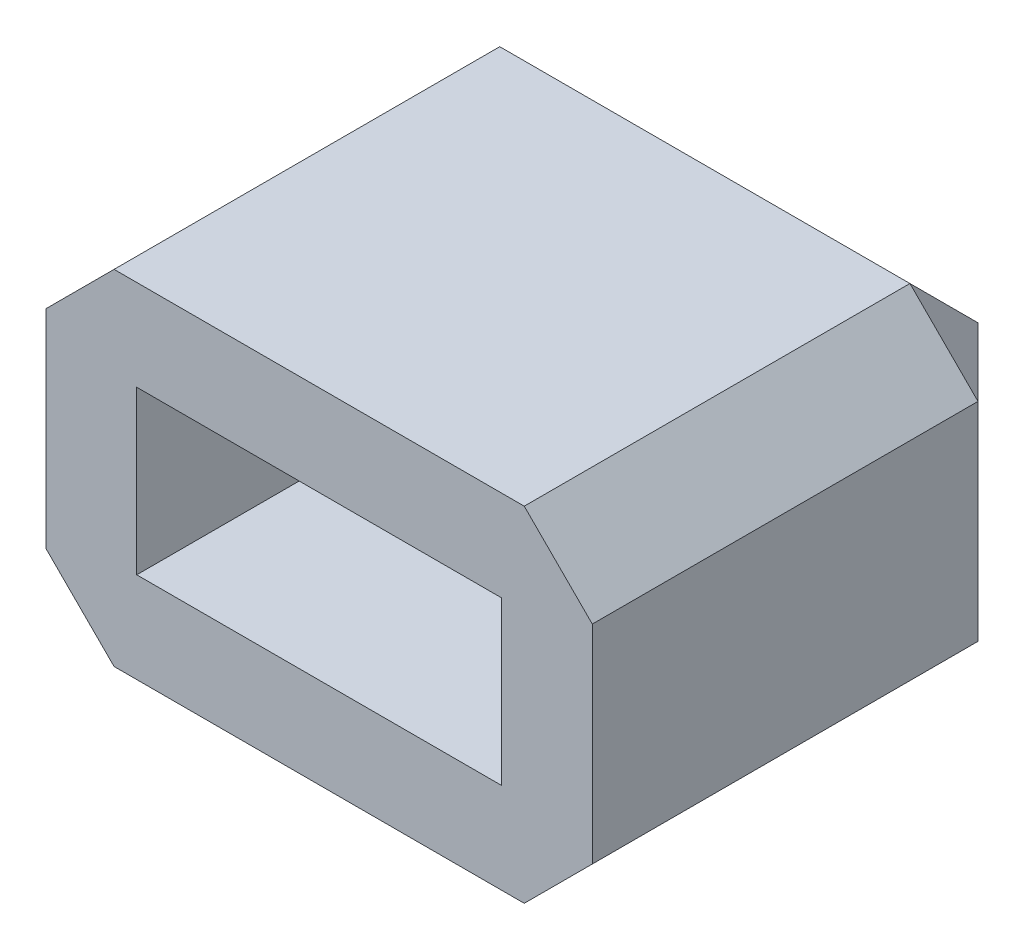
ISO-10303-21;
HEADER;
FILE_DESCRIPTION(('STEP AP214'),'2;1');
FILE_NAME('part.step','',(''),(''),'','','');
FILE_SCHEMA(('AUTOMOTIVE_DESIGN { 1 0 10303 214 1 1 1 1 }'));
ENDSEC;
DATA;
#1=APPLICATION_CONTEXT('core data for automotive mechanical design processes');
#2=APPLICATION_PROTOCOL_DEFINITION('international standard','automotive_design',2000,#1);
#3=PRODUCT_CONTEXT('',#1,'mechanical');
#4=PRODUCT('Part','Part','',(#3));
#5=PRODUCT_RELATED_PRODUCT_CATEGORY('part','',(#4));
#6=PRODUCT_DEFINITION_FORMATION('','',#4);
#7=PRODUCT_DEFINITION_CONTEXT('part definition',#1,'design');
#8=PRODUCT_DEFINITION('design','',#6,#7);
#9=PRODUCT_DEFINITION_SHAPE('','',#8);
#10=(LENGTH_UNIT() NAMED_UNIT(*) SI_UNIT(.MILLI.,.METRE.));
#11=(NAMED_UNIT(*) PLANE_ANGLE_UNIT() SI_UNIT($,.RADIAN.));
#12=(NAMED_UNIT(*) SI_UNIT($,.STERADIAN.) SOLID_ANGLE_UNIT());
#13=UNCERTAINTY_MEASURE_WITH_UNIT(LENGTH_MEASURE(1.E-05),#10,'distance_accuracy_value','');
#14=(GEOMETRIC_REPRESENTATION_CONTEXT(3) GLOBAL_UNCERTAINTY_ASSIGNED_CONTEXT((#13)) GLOBAL_UNIT_ASSIGNED_CONTEXT((#10,
#11,#12)) REPRESENTATION_CONTEXT('',''));
#15=CARTESIAN_POINT('',(0.,0.,0.));
#16=DIRECTION('',(0.,0.,1.));
#17=DIRECTION('',(1.,0.,0.));
#18=AXIS2_PLACEMENT_3D('',#15,#16,#17);
#19=CARTESIAN_POINT('',(0.,0.,8.));
#20=DIRECTION('',(0.,0.,1.));
#21=DIRECTION('',(1.,0.,0.));
#22=AXIS2_PLACEMENT_3D('',#19,#20,#21);
#23=PLANE('',#22);
#24=DIRECTION('',(0.,-1.,0.));
#25=VECTOR('',#24,1.);
#26=CARTESIAN_POINT('',(-6.02,3.79,8.));
#27=LINE('',#26,#25);
#28=CARTESIAN_POINT('',(-6.02,2.29,8.));
#29=VERTEX_POINT('',#28);
#30=CARTESIAN_POINT('',(-6.02,-2.29,8.));
#31=VERTEX_POINT('',#30);
#32=EDGE_CURVE('E200',#29,#31,#27,.T.);
#33=ORIENTED_EDGE('',*,*,#32,.T.);
#34=DIRECTION('',(-0.707106781186547,0.707106781186548,0.));
#35=VECTOR('',#34,1.);
#36=CARTESIAN_POINT('',(-4.15500000000001,-4.155,8.));
#37=LINE('',#36,#35);
#38=CARTESIAN_POINT('',(-4.52,-3.79,8.));
#39=VERTEX_POINT('',#38);
#40=EDGE_CURVE('E236',#31,#39,#37,.F.);
#41=ORIENTED_EDGE('',*,*,#40,.T.);
#42=DIRECTION('',(1.,0.,0.));
#43=VECTOR('',#42,1.);
#44=CARTESIAN_POINT('',(-6.02,-3.79,8.));
#45=LINE('',#44,#43);
#46=CARTESIAN_POINT('',(4.52,-3.79,8.));
#47=VERTEX_POINT('',#46);
#48=EDGE_CURVE('E204',#39,#47,#45,.T.);
#49=ORIENTED_EDGE('',*,*,#48,.T.);
#50=DIRECTION('',(-0.707106781186547,-0.707106781186548,0.));
#51=VECTOR('',#50,1.);
#52=CARTESIAN_POINT('',(4.15500000000001,-4.155,8.));
#53=LINE('',#52,#51);
#54=CARTESIAN_POINT('',(6.02,-2.29,8.));
#55=VERTEX_POINT('',#54);
#56=EDGE_CURVE('E227',#47,#55,#53,.F.);
#57=ORIENTED_EDGE('',*,*,#56,.T.);
#58=DIRECTION('',(0.,1.,0.));
#59=VECTOR('',#58,1.);
#60=CARTESIAN_POINT('',(6.02,3.79,8.));
#61=LINE('',#60,#59);
#62=CARTESIAN_POINT('',(6.02,2.29,8.));
#63=VERTEX_POINT('',#62);
#64=EDGE_CURVE('E192',#55,#63,#61,.T.);
#65=ORIENTED_EDGE('',*,*,#64,.T.);
#66=DIRECTION('',(0.707106781186547,-0.707106781186548,0.));
#67=VECTOR('',#66,1.);
#68=CARTESIAN_POINT('',(4.15500000000001,4.155,8.));
#69=LINE('',#68,#67);
#70=CARTESIAN_POINT('',(4.52,3.79,8.));
#71=VERTEX_POINT('',#70);
#72=EDGE_CURVE('E230',#63,#71,#69,.F.);
#73=ORIENTED_EDGE('',*,*,#72,.T.);
#74=DIRECTION('',(-1.,0.,0.));
#75=VECTOR('',#74,1.);
#76=CARTESIAN_POINT('',(-6.02,3.79,8.));
#77=LINE('',#76,#75);
#78=CARTESIAN_POINT('',(-4.52,3.79,8.));
#79=VERTEX_POINT('',#78);
#80=EDGE_CURVE('E196',#71,#79,#77,.T.);
#81=ORIENTED_EDGE('',*,*,#80,.T.);
#82=DIRECTION('',(0.707106781186548,0.707106781186547,0.));
#83=VECTOR('',#82,1.);
#84=CARTESIAN_POINT('',(-4.15499999999999,4.155,8.));
#85=LINE('',#84,#83);
#86=EDGE_CURVE('E233',#79,#29,#85,.F.);
#87=ORIENTED_EDGE('',*,*,#86,.T.);
#88=EDGE_LOOP('',(#33,#41,#49,#57,#65,#73,#81,#87));
#89=FACE_BOUND('',#88,.T.);
#90=DIRECTION('',(1.,0.,0.));
#91=VECTOR('',#90,1.);
#92=CARTESIAN_POINT('',(4.02,-1.79,8.));
#93=LINE('',#92,#91);
#94=CARTESIAN_POINT('',(-4.02,-1.79,8.));
#95=VERTEX_POINT('',#94);
#96=CARTESIAN_POINT('',(4.02,-1.79,8.));
#97=VERTEX_POINT('',#96);
#98=EDGE_CURVE('E180',#95,#97,#93,.T.);
#99=ORIENTED_EDGE('',*,*,#98,.F.);
#100=DIRECTION('',(0.,-1.,0.));
#101=VECTOR('',#100,1.);
#102=CARTESIAN_POINT('',(-4.02,-1.79,8.));
#103=LINE('',#102,#101);
#104=CARTESIAN_POINT('',(-4.02,1.79,8.));
#105=VERTEX_POINT('',#104);
#106=EDGE_CURVE('E175',#105,#95,#103,.T.);
#107=ORIENTED_EDGE('',*,*,#106,.F.);
#108=DIRECTION('',(-1.,0.,0.));
#109=VECTOR('',#108,1.);
#110=CARTESIAN_POINT('',(4.02,1.79,8.));
#111=LINE('',#110,#109);
#112=CARTESIAN_POINT('',(4.02,1.79,8.));
#113=VERTEX_POINT('',#112);
#114=EDGE_CURVE('E154',#113,#105,#111,.T.);
#115=ORIENTED_EDGE('',*,*,#114,.F.);
#116=DIRECTION('',(0.,1.,0.));
#117=VECTOR('',#116,1.);
#118=CARTESIAN_POINT('',(4.02,-1.79,8.));
#119=LINE('',#118,#117);
#120=EDGE_CURVE('E616',#97,#113,#119,.T.);
#121=ORIENTED_EDGE('',*,*,#120,.F.);
#122=EDGE_LOOP('',(#99,#107,#115,#121));
#123=FACE_BOUND('',#122,.T.);
#124=ADVANCED_FACE('F45',(#89,#123),#23,.T.);
#125=CARTESIAN_POINT('',(6.02,3.79,8.));
#126=DIRECTION('',(-1.,0.,0.));
#127=DIRECTION('',(0.,0.,1.));
#128=AXIS2_PLACEMENT_3D('',#125,#126,#127);
#129=PLANE('',#128);
#130=DIRECTION('',(0.,1.,0.));
#131=VECTOR('',#130,1.);
#132=CARTESIAN_POINT('',(6.02,3.79,-0.499999999999999));
#133=LINE('',#132,#131);
#134=CARTESIAN_POINT('',(6.02,-2.29,-0.499999999999999));
#135=VERTEX_POINT('',#134);
#136=CARTESIAN_POINT('',(6.02,2.29,-0.499999999999999));
#137=VERTEX_POINT('',#136);
#138=EDGE_CURVE('E63',#135,#137,#133,.T.);
#139=ORIENTED_EDGE('',*,*,#138,.T.);
#140=DIRECTION('',(0.,0.,1.));
#141=VECTOR('',#140,1.);
#142=CARTESIAN_POINT('',(6.02,2.29,8.));
#143=LINE('',#142,#141);
#144=EDGE_CURVE('E11',#137,#63,#143,.T.);
#145=ORIENTED_EDGE('',*,*,#144,.T.);
#146=ORIENTED_EDGE('',*,*,#64,.F.);
#147=DIRECTION('',(0.,0.,-1.));
#148=VECTOR('',#147,1.);
#149=CARTESIAN_POINT('',(6.02,-2.29,8.));
#150=LINE('',#149,#148);
#151=EDGE_CURVE('E56',#55,#135,#150,.T.);
#152=ORIENTED_EDGE('',*,*,#151,.T.);
#153=EDGE_LOOP('',(#139,#145,#146,#152));
#154=FACE_BOUND('',#153,.T.);
#155=ADVANCED_FACE('F320',(#154),#129,.F.);
#156=CARTESIAN_POINT('',(-6.02,3.79,8.));
#157=DIRECTION('',(0.,-1.,0.));
#158=DIRECTION('',(0.,0.,-1.));
#159=AXIS2_PLACEMENT_3D('',#156,#157,#158);
#160=PLANE('',#159);
#161=DIRECTION('',(-1.,0.,0.));
#162=VECTOR('',#161,1.);
#163=CARTESIAN_POINT('',(-6.02,3.79,-0.499999999999999));
#164=LINE('',#163,#162);
#165=CARTESIAN_POINT('',(4.52,3.79,-0.499999999999999));
#166=VERTEX_POINT('',#165);
#167=CARTESIAN_POINT('',(-4.52,3.79,-0.499999999999999));
#168=VERTEX_POINT('',#167);
#169=EDGE_CURVE('E255',#166,#168,#164,.T.);
#170=ORIENTED_EDGE('',*,*,#169,.T.);
#171=DIRECTION('',(0.,0.,1.));
#172=VECTOR('',#171,1.);
#173=CARTESIAN_POINT('',(-4.52,3.79,8.));
#174=LINE('',#173,#172);
#175=EDGE_CURVE('E258',#168,#79,#174,.T.);
#176=ORIENTED_EDGE('',*,*,#175,.T.);
#177=ORIENTED_EDGE('',*,*,#80,.F.);
#178=DIRECTION('',(0.,0.,-1.));
#179=VECTOR('',#178,1.);
#180=CARTESIAN_POINT('',(4.52,3.79,8.));
#181=LINE('',#180,#179);
#182=EDGE_CURVE('E252',#71,#166,#181,.T.);
#183=ORIENTED_EDGE('',*,*,#182,.T.);
#184=EDGE_LOOP('',(#170,#176,#177,#183));
#185=FACE_BOUND('',#184,.T.);
#186=ADVANCED_FACE('F345',(#185),#160,.F.);
#187=CARTESIAN_POINT('',(-6.02,3.79,8.));
#188=DIRECTION('',(1.,0.,0.));
#189=DIRECTION('',(0.,0.,-1.));
#190=AXIS2_PLACEMENT_3D('',#187,#188,#189);
#191=PLANE('',#190);
#192=DIRECTION('',(0.,-1.,0.));
#193=VECTOR('',#192,1.);
#194=CARTESIAN_POINT('',(-6.02,3.79,-0.499999999999999));
#195=LINE('',#194,#193);
#196=CARTESIAN_POINT('',(-6.02,2.29,-0.499999999999999));
#197=VERTEX_POINT('',#196);
#198=CARTESIAN_POINT('',(-6.02,-2.29,-0.499999999999999));
#199=VERTEX_POINT('',#198);
#200=EDGE_CURVE('E221',#197,#199,#195,.T.);
#201=ORIENTED_EDGE('',*,*,#200,.T.);
#202=DIRECTION('',(0.,0.,1.));
#203=VECTOR('',#202,1.);
#204=CARTESIAN_POINT('',(-6.02,-2.29,8.));
#205=LINE('',#204,#203);
#206=EDGE_CURVE('E224',#199,#31,#205,.T.);
#207=ORIENTED_EDGE('',*,*,#206,.T.);
#208=ORIENTED_EDGE('',*,*,#32,.F.);
#209=DIRECTION('',(0.,0.,-1.));
#210=VECTOR('',#209,1.);
#211=CARTESIAN_POINT('',(-6.02,2.29,8.));
#212=LINE('',#211,#210);
#213=EDGE_CURVE('E218',#29,#197,#212,.T.);
#214=ORIENTED_EDGE('',*,*,#213,.T.);
#215=EDGE_LOOP('',(#201,#207,#208,#214));
#216=FACE_BOUND('',#215,.T.);
#217=ADVANCED_FACE('F355',(#216),#191,.F.);
#218=CARTESIAN_POINT('',(-6.02,-3.79,8.));
#219=DIRECTION('',(0.,1.,0.));
#220=DIRECTION('',(0.,0.,1.));
#221=AXIS2_PLACEMENT_3D('',#218,#219,#220);
#222=PLANE('',#221);
#223=ORIENTED_EDGE('',*,*,#48,.F.);
#224=DIRECTION('',(0.,0.,-1.));
#225=VECTOR('',#224,1.);
#226=CARTESIAN_POINT('',(-4.52,-3.79,8.));
#227=LINE('',#226,#225);
#228=CARTESIAN_POINT('',(-4.52,-3.79,-0.499999999999999));
#229=VERTEX_POINT('',#228);
#230=EDGE_CURVE('E214',#39,#229,#227,.T.);
#231=ORIENTED_EDGE('',*,*,#230,.T.);
#232=DIRECTION('',(1.,0.,0.));
#233=VECTOR('',#232,1.);
#234=CARTESIAN_POINT('',(-6.02,-3.79,-0.499999999999999));
#235=LINE('',#234,#233);
#236=CARTESIAN_POINT('',(4.52,-3.79,-0.499999999999999));
#237=VERTEX_POINT('',#236);
#238=EDGE_CURVE('E211',#229,#237,#235,.T.);
#239=ORIENTED_EDGE('',*,*,#238,.T.);
#240=DIRECTION('',(0.,0.,1.));
#241=VECTOR('',#240,1.);
#242=CARTESIAN_POINT('',(4.52,-3.79,8.));
#243=LINE('',#242,#241);
#244=EDGE_CURVE('E208',#237,#47,#243,.T.);
#245=ORIENTED_EDGE('',*,*,#244,.T.);
#246=EDGE_LOOP('',(#223,#231,#239,#245));
#247=FACE_BOUND('',#246,.T.);
#248=ADVANCED_FACE('F370',(#247),#222,.F.);
#249=CARTESIAN_POINT('',(-4.02,-1.79,8.));
#250=DIRECTION('',(1.,0.,0.));
#251=DIRECTION('',(0.,0.,-1.));
#252=AXIS2_PLACEMENT_3D('',#249,#250,#251);
#253=PLANE('',#252);
#254=DIRECTION('',(0.,-1.,0.));
#255=VECTOR('',#254,1.);
#256=CARTESIAN_POINT('',(-4.02,-1.79,0.));
#257=LINE('',#256,#255);
#258=CARTESIAN_POINT('',(-4.02,1.79,0.));
#259=VERTEX_POINT('',#258);
#260=CARTESIAN_POINT('',(-4.02,-1.79,0.));
#261=VERTEX_POINT('',#260);
#262=EDGE_CURVE('E162',#259,#261,#257,.T.);
#263=ORIENTED_EDGE('',*,*,#262,.F.);
#264=DIRECTION('',(0.,0.,-1.));
#265=VECTOR('',#264,1.);
#266=CARTESIAN_POINT('',(-4.02,1.79,8.));
#267=LINE('',#266,#265);
#268=EDGE_CURVE('E147',#105,#259,#267,.T.);
#269=ORIENTED_EDGE('',*,*,#268,.F.);
#270=ORIENTED_EDGE('',*,*,#106,.T.);
#271=DIRECTION('',(0.,0.,-1.));
#272=VECTOR('',#271,1.);
#273=CARTESIAN_POINT('',(-4.02,-1.79,8.));
#274=LINE('',#273,#272);
#275=EDGE_CURVE('E165',#95,#261,#274,.T.);
#276=ORIENTED_EDGE('',*,*,#275,.T.);
#277=EDGE_LOOP('',(#263,#269,#270,#276));
#278=FACE_BOUND('',#277,.T.);
#279=ADVANCED_FACE('F163',(#278),#253,.T.);
#280=CARTESIAN_POINT('',(4.02,-1.79,8.));
#281=DIRECTION('',(0.,1.,0.));
#282=DIRECTION('',(0.,0.,1.));
#283=AXIS2_PLACEMENT_3D('',#280,#281,#282);
#284=PLANE('',#283);
#285=DIRECTION('',(1.,0.,0.));
#286=VECTOR('',#285,1.);
#287=CARTESIAN_POINT('',(4.02,-1.79,0.));
#288=LINE('',#287,#286);
#289=CARTESIAN_POINT('',(4.02,-1.79,0.));
#290=VERTEX_POINT('',#289);
#291=EDGE_CURVE('E169',#261,#290,#288,.T.);
#292=ORIENTED_EDGE('',*,*,#291,.F.);
#293=ORIENTED_EDGE('',*,*,#275,.F.);
#294=ORIENTED_EDGE('',*,*,#98,.T.);
#295=DIRECTION('',(0.,0.,-1.));
#296=VECTOR('',#295,1.);
#297=CARTESIAN_POINT('',(4.02,-1.79,8.));
#298=LINE('',#297,#296);
#299=EDGE_CURVE('E187',#97,#290,#298,.T.);
#300=ORIENTED_EDGE('',*,*,#299,.T.);
#301=EDGE_LOOP('',(#292,#293,#294,#300));
#302=FACE_BOUND('',#301,.T.);
#303=ADVANCED_FACE('F378',(#302),#284,.T.);
#304=CARTESIAN_POINT('',(4.02,-1.79,8.));
#305=DIRECTION('',(-1.,0.,0.));
#306=DIRECTION('',(0.,0.,1.));
#307=AXIS2_PLACEMENT_3D('',#304,#305,#306);
#308=PLANE('',#307);
#309=DIRECTION('',(0.,1.,0.));
#310=VECTOR('',#309,1.);
#311=CARTESIAN_POINT('',(4.02,-1.79,0.));
#312=LINE('',#311,#310);
#313=CARTESIAN_POINT('',(4.02,1.79,0.));
#314=VERTEX_POINT('',#313);
#315=EDGE_CURVE('E173',#290,#314,#312,.T.);
#316=ORIENTED_EDGE('',*,*,#315,.F.);
#317=ORIENTED_EDGE('',*,*,#299,.F.);
#318=ORIENTED_EDGE('',*,*,#120,.T.);
#319=DIRECTION('',(0.,0.,-1.));
#320=VECTOR('',#319,1.);
#321=CARTESIAN_POINT('',(4.02,1.79,8.));
#322=LINE('',#321,#320);
#323=EDGE_CURVE('E158',#113,#314,#322,.T.);
#324=ORIENTED_EDGE('',*,*,#323,.T.);
#325=EDGE_LOOP('',(#316,#317,#318,#324));
#326=FACE_BOUND('',#325,.T.);
#327=ADVANCED_FACE('F391',(#326),#308,.T.);
#328=CARTESIAN_POINT('',(4.02,1.79,8.));
#329=DIRECTION('',(0.,-1.,0.));
#330=DIRECTION('',(0.,0.,-1.));
#331=AXIS2_PLACEMENT_3D('',#328,#329,#330);
#332=PLANE('',#331);
#333=DIRECTION('',(-1.,0.,0.));
#334=VECTOR('',#333,1.);
#335=CARTESIAN_POINT('',(4.02,1.79,0.));
#336=LINE('',#335,#334);
#337=EDGE_CURVE('E151',#314,#259,#336,.T.);
#338=ORIENTED_EDGE('',*,*,#337,.F.);
#339=ORIENTED_EDGE('',*,*,#323,.F.);
#340=ORIENTED_EDGE('',*,*,#114,.T.);
#341=ORIENTED_EDGE('',*,*,#268,.T.);
#342=EDGE_LOOP('',(#338,#339,#340,#341));
#343=FACE_BOUND('',#342,.T.);
#344=ADVANCED_FACE('F149',(#343),#332,.T.);
#345=CARTESIAN_POINT('',(0.,0.,0.));
#346=DIRECTION('',(0.,0.,1.));
#347=DIRECTION('',(1.,0.,0.));
#348=AXIS2_PLACEMENT_3D('',#345,#346,#347);
#349=PLANE('',#348);
#350=ORIENTED_EDGE('',*,*,#337,.T.);
#351=ORIENTED_EDGE('',*,*,#262,.T.);
#352=ORIENTED_EDGE('',*,*,#291,.T.);
#353=ORIENTED_EDGE('',*,*,#315,.T.);
#354=EDGE_LOOP('',(#350,#351,#352,#353));
#355=FACE_BOUND('',#354,.T.);
#356=ADVANCED_FACE('F171',(#355),#349,.T.);
#357=CARTESIAN_POINT('',(0.,0.,-2.));
#358=DIRECTION('',(0.,0.,1.));
#359=DIRECTION('',(1.,0.,0.));
#360=AXIS2_PLACEMENT_3D('',#357,#358,#359);
#361=PLANE('',#360);
#362=DIRECTION('',(0.,-1.,0.));
#363=VECTOR('',#362,1.);
#364=CARTESIAN_POINT('',(4.52,0.,-2.));
#365=LINE('',#364,#363);
#366=CARTESIAN_POINT('',(4.52,2.29,-2.));
#367=VERTEX_POINT('',#366);
#368=CARTESIAN_POINT('',(4.52,-2.29,-2.));
#369=VERTEX_POINT('',#368);
#370=EDGE_CURVE('E239',#367,#369,#365,.T.);
#371=ORIENTED_EDGE('',*,*,#370,.T.);
#372=DIRECTION('',(-1.,0.,0.));
#373=VECTOR('',#372,1.);
#374=CARTESIAN_POINT('',(0.,-2.29,-2.));
#375=LINE('',#374,#373);
#376=CARTESIAN_POINT('',(-4.52,-2.29,-2.));
#377=VERTEX_POINT('',#376);
#378=EDGE_CURVE('E248',#369,#377,#375,.T.);
#379=ORIENTED_EDGE('',*,*,#378,.T.);
#380=DIRECTION('',(0.,1.,0.));
#381=VECTOR('',#380,1.);
#382=CARTESIAN_POINT('',(-4.52,0.,-2.));
#383=LINE('',#382,#381);
#384=CARTESIAN_POINT('',(-4.52,2.29,-2.));
#385=VERTEX_POINT('',#384);
#386=EDGE_CURVE('E245',#377,#385,#383,.T.);
#387=ORIENTED_EDGE('',*,*,#386,.T.);
#388=DIRECTION('',(1.,0.,0.));
#389=VECTOR('',#388,1.);
#390=CARTESIAN_POINT('',(0.,2.29,-2.));
#391=LINE('',#390,#389);
#392=EDGE_CURVE('E242',#385,#367,#391,.T.);
#393=ORIENTED_EDGE('',*,*,#392,.T.);
#394=EDGE_LOOP('',(#371,#379,#387,#393));
#395=FACE_BOUND('',#394,.T.);
#396=ADVANCED_FACE('F337',(#395),#361,.F.);
#397=CARTESIAN_POINT('',(4.52,3.79,8.));
#398=DIRECTION('',(-0.707106781186548,-0.707106781186547,0.));
#399=DIRECTION('',(0.,0.,-1.));
#400=AXIS2_PLACEMENT_3D('',#397,#398,#399);
#401=PLANE('',#400);
#402=DIRECTION('',(-0.707106781186547,0.707106781186548,0.));
#403=VECTOR('',#402,1.);
#404=CARTESIAN_POINT('',(5.27,3.04,-0.499999999999999));
#405=LINE('',#404,#403);
#406=EDGE_CURVE('E50',#166,#137,#405,.F.);
#407=ORIENTED_EDGE('',*,*,#406,.F.);
#408=ORIENTED_EDGE('',*,*,#182,.F.);
#409=ORIENTED_EDGE('',*,*,#72,.F.);
#410=ORIENTED_EDGE('',*,*,#144,.F.);
#411=EDGE_LOOP('',(#407,#408,#409,#410));
#412=FACE_BOUND('',#411,.T.);
#413=ADVANCED_FACE('F48',(#412),#401,.F.);
#414=CARTESIAN_POINT('',(4.52,2.29,-2.));
#415=DIRECTION('',(0.577350269189627,0.577350269189626,-0.577350269189624));
#416=DIRECTION('',(-0.707106781186547,0.707106781186548,0.));
#417=AXIS2_PLACEMENT_3D('',#414,#415,#416);
#418=PLANE('',#417);
#419=DIRECTION('',(0.,-0.707106781186547,-0.707106781186548));
#420=VECTOR('',#419,1.);
#421=CARTESIAN_POINT('',(4.52,2.29,-2.));
#422=LINE('',#421,#420);
#423=EDGE_CURVE('E299',#166,#367,#422,.T.);
#424=ORIENTED_EDGE('',*,*,#423,.F.);
#425=ORIENTED_EDGE('',*,*,#406,.T.);
#426=DIRECTION('',(0.707106781186547,0.,0.707106781186548));
#427=VECTOR('',#426,1.);
#428=CARTESIAN_POINT('',(4.52,2.29,-2.));
#429=LINE('',#428,#427);
#430=EDGE_CURVE('E302',#367,#137,#429,.T.);
#431=ORIENTED_EDGE('',*,*,#430,.F.);
#432=EDGE_LOOP('',(#424,#425,#431));
#433=FACE_BOUND('',#432,.T.);
#434=ADVANCED_FACE('F315',(#433),#418,.T.);
#435=CARTESIAN_POINT('',(6.02,-2.29,8.));
#436=DIRECTION('',(-0.707106781186548,0.707106781186547,0.));
#437=DIRECTION('',(0.,0.,-1.));
#438=AXIS2_PLACEMENT_3D('',#435,#436,#437);
#439=PLANE('',#438);
#440=ORIENTED_EDGE('',*,*,#56,.F.);
#441=ORIENTED_EDGE('',*,*,#244,.F.);
#442=DIRECTION('',(0.707106781186547,0.707106781186548,0.));
#443=VECTOR('',#442,1.);
#444=CARTESIAN_POINT('',(4.52,-3.79,-0.499999999999999));
#445=LINE('',#444,#443);
#446=EDGE_CURVE('E295',#135,#237,#445,.F.);
#447=ORIENTED_EDGE('',*,*,#446,.F.);
#448=ORIENTED_EDGE('',*,*,#151,.F.);
#449=EDGE_LOOP('',(#440,#441,#447,#448));
#450=FACE_BOUND('',#449,.T.);
#451=ADVANCED_FACE('F328',(#450),#439,.F.);
#452=CARTESIAN_POINT('',(4.52,0.,-2.));
#453=DIRECTION('',(-0.707106781186548,0.,0.707106781186547));
#454=DIRECTION('',(0.,-1.,0.));
#455=AXIS2_PLACEMENT_3D('',#452,#453,#454);
#456=PLANE('',#455);
#457=ORIENTED_EDGE('',*,*,#430,.T.);
#458=ORIENTED_EDGE('',*,*,#138,.F.);
#459=DIRECTION('',(-0.707106781186547,0.,-0.707106781186548));
#460=VECTOR('',#459,1.);
#461=CARTESIAN_POINT('',(5.27,-2.29,-1.25));
#462=LINE('',#461,#460);
#463=EDGE_CURVE('E291',#369,#135,#462,.F.);
#464=ORIENTED_EDGE('',*,*,#463,.F.);
#465=ORIENTED_EDGE('',*,*,#370,.F.);
#466=EDGE_LOOP('',(#457,#458,#464,#465));
#467=FACE_BOUND('',#466,.T.);
#468=ADVANCED_FACE('F335',(#467),#456,.F.);
#469=CARTESIAN_POINT('',(0.,2.29,-2.));
#470=DIRECTION('',(0.,-0.707106781186548,0.707106781186547));
#471=DIRECTION('',(1.,0.,0.));
#472=AXIS2_PLACEMENT_3D('',#469,#470,#471);
#473=PLANE('',#472);
#474=ORIENTED_EDGE('',*,*,#423,.T.);
#475=ORIENTED_EDGE('',*,*,#392,.F.);
#476=DIRECTION('',(0.,0.707106781186547,0.707106781186548));
#477=VECTOR('',#476,1.);
#478=CARTESIAN_POINT('',(-4.52,2.29,-2.));
#479=LINE('',#478,#477);
#480=EDGE_CURVE('E287',#168,#385,#479,.F.);
#481=ORIENTED_EDGE('',*,*,#480,.F.);
#482=ORIENTED_EDGE('',*,*,#169,.F.);
#483=EDGE_LOOP('',(#474,#475,#481,#482));
#484=FACE_BOUND('',#483,.T.);
#485=ADVANCED_FACE('F342',(#484),#473,.F.);
#486=CARTESIAN_POINT('',(-6.02,2.29,8.));
#487=DIRECTION('',(0.707106781186547,-0.707106781186548,0.));
#488=DIRECTION('',(0.,0.,-1.));
#489=AXIS2_PLACEMENT_3D('',#486,#487,#488);
#490=PLANE('',#489);
#491=ORIENTED_EDGE('',*,*,#86,.F.);
#492=ORIENTED_EDGE('',*,*,#175,.F.);
#493=DIRECTION('',(-0.707106781186548,-0.707106781186547,0.));
#494=VECTOR('',#493,1.);
#495=CARTESIAN_POINT('',(-5.27,3.04,-0.499999999999999));
#496=LINE('',#495,#494);
#497=EDGE_CURVE('E283',#197,#168,#496,.F.);
#498=ORIENTED_EDGE('',*,*,#497,.F.);
#499=ORIENTED_EDGE('',*,*,#213,.F.);
#500=EDGE_LOOP('',(#491,#492,#498,#499));
#501=FACE_BOUND('',#500,.T.);
#502=ADVANCED_FACE('F349',(#501),#490,.F.);
#503=CARTESIAN_POINT('',(4.52,-3.79,-0.499999999999999));
#504=DIRECTION('',(0.577350269189627,-0.577350269189626,-0.577350269189624));
#505=DIRECTION('',(0.707106781186547,0.707106781186548,0.));
#506=AXIS2_PLACEMENT_3D('',#503,#504,#505);
#507=PLANE('',#506);
#508=ORIENTED_EDGE('',*,*,#463,.T.);
#509=ORIENTED_EDGE('',*,*,#446,.T.);
#510=DIRECTION('',(0.,-0.707106781186547,0.707106781186548));
#511=VECTOR('',#510,1.);
#512=CARTESIAN_POINT('',(4.52,-3.79,-0.499999999999999));
#513=LINE('',#512,#511);
#514=EDGE_CURVE('E279',#369,#237,#513,.T.);
#515=ORIENTED_EDGE('',*,*,#514,.F.);
#516=EDGE_LOOP('',(#508,#509,#515));
#517=FACE_BOUND('',#516,.T.);
#518=ADVANCED_FACE('F333',(#517),#507,.T.);
#519=CARTESIAN_POINT('',(-4.52,2.29,-2.));
#520=DIRECTION('',(-0.577350269189626,0.577350269189627,-0.577350269189624));
#521=DIRECTION('',(-0.707106781186548,-0.707106781186547,0.));
#522=AXIS2_PLACEMENT_3D('',#519,#520,#521);
#523=PLANE('',#522);
#524=ORIENTED_EDGE('',*,*,#497,.T.);
#525=ORIENTED_EDGE('',*,*,#480,.T.);
#526=DIRECTION('',(0.707106781186547,0.,-0.707106781186548));
#527=VECTOR('',#526,1.);
#528=CARTESIAN_POINT('',(-4.52,2.29,-2.));
#529=LINE('',#528,#527);
#530=EDGE_CURVE('E275',#197,#385,#529,.T.);
#531=ORIENTED_EDGE('',*,*,#530,.F.);
#532=EDGE_LOOP('',(#524,#525,#531));
#533=FACE_BOUND('',#532,.T.);
#534=ADVANCED_FACE('F437',(#533),#523,.T.);
#535=CARTESIAN_POINT('',(-6.02,-3.79,-0.499999999999999));
#536=DIRECTION('',(0.,0.707106781186548,0.707106781186547));
#537=DIRECTION('',(1.,0.,0.));
#538=AXIS2_PLACEMENT_3D('',#535,#536,#537);
#539=PLANE('',#538);
#540=ORIENTED_EDGE('',*,*,#514,.T.);
#541=ORIENTED_EDGE('',*,*,#238,.F.);
#542=DIRECTION('',(0.,0.707106781186547,-0.707106781186548));
#543=VECTOR('',#542,1.);
#544=CARTESIAN_POINT('',(-4.52,-3.79,-0.499999999999999));
#545=LINE('',#544,#543);
#546=EDGE_CURVE('E271',#377,#229,#545,.F.);
#547=ORIENTED_EDGE('',*,*,#546,.F.);
#548=ORIENTED_EDGE('',*,*,#378,.F.);
#549=EDGE_LOOP('',(#540,#541,#547,#548));
#550=FACE_BOUND('',#549,.T.);
#551=ADVANCED_FACE('F368',(#550),#539,.F.);
#552=CARTESIAN_POINT('',(-6.02,3.79,-0.499999999999999));
#553=DIRECTION('',(0.707106781186548,0.,0.707106781186547));
#554=DIRECTION('',(0.,-1.,0.));
#555=AXIS2_PLACEMENT_3D('',#552,#553,#554);
#556=PLANE('',#555);
#557=ORIENTED_EDGE('',*,*,#530,.T.);
#558=ORIENTED_EDGE('',*,*,#386,.F.);
#559=DIRECTION('',(-0.707106781186547,0.,0.707106781186548));
#560=VECTOR('',#559,1.);
#561=CARTESIAN_POINT('',(-5.27,-2.29,-1.25));
#562=LINE('',#561,#560);
#563=EDGE_CURVE('E268',#199,#377,#562,.F.);
#564=ORIENTED_EDGE('',*,*,#563,.F.);
#565=ORIENTED_EDGE('',*,*,#200,.F.);
#566=EDGE_LOOP('',(#557,#558,#564,#565));
#567=FACE_BOUND('',#566,.T.);
#568=ADVANCED_FACE('F449',(#567),#556,.F.);
#569=CARTESIAN_POINT('',(-4.52,-3.79,-0.499999999999999));
#570=DIRECTION('',(-0.577350269189627,-0.577350269189626,-0.577350269189624));
#571=DIRECTION('',(0.707106781186547,-0.707106781186548,0.));
#572=AXIS2_PLACEMENT_3D('',#569,#570,#571);
#573=PLANE('',#572);
#574=ORIENTED_EDGE('',*,*,#563,.T.);
#575=ORIENTED_EDGE('',*,*,#546,.T.);
#576=DIRECTION('',(0.707106781186547,-0.707106781186548,0.));
#577=VECTOR('',#576,1.);
#578=CARTESIAN_POINT('',(-4.52,-3.79,-0.499999999999999));
#579=LINE('',#578,#577);
#580=EDGE_CURVE('E265',#199,#229,#579,.T.);
#581=ORIENTED_EDGE('',*,*,#580,.F.);
#582=EDGE_LOOP('',(#574,#575,#581));
#583=FACE_BOUND('',#582,.T.);
#584=ADVANCED_FACE('F364',(#583),#573,.T.);
#585=CARTESIAN_POINT('',(-4.52,-3.79,8.));
#586=DIRECTION('',(0.707106781186548,0.707106781186547,0.));
#587=DIRECTION('',(0.,0.,-1.));
#588=AXIS2_PLACEMENT_3D('',#585,#586,#587);
#589=PLANE('',#588);
#590=ORIENTED_EDGE('',*,*,#40,.F.);
#591=ORIENTED_EDGE('',*,*,#206,.F.);
#592=ORIENTED_EDGE('',*,*,#580,.T.);
#593=ORIENTED_EDGE('',*,*,#230,.F.);
#594=EDGE_LOOP('',(#590,#591,#592,#593));
#595=FACE_BOUND('',#594,.T.);
#596=ADVANCED_FACE('F361',(#595),#589,.F.);
#597=CLOSED_SHELL('',(#124,#155,#186,#217,#248,#279,#303,#327,#344,#356,#396,#413,#434,#451,
#468,#485,#502,#518,#534,#551,#568,#584,#596));
#598=MANIFOLD_SOLID_BREP('B2',#597);
#599=ADVANCED_BREP_SHAPE_REPRESENTATION('',(#18,#598),#14);
#600=SHAPE_DEFINITION_REPRESENTATION(#9,#599);
ENDSEC;
END-ISO-10303-21;
